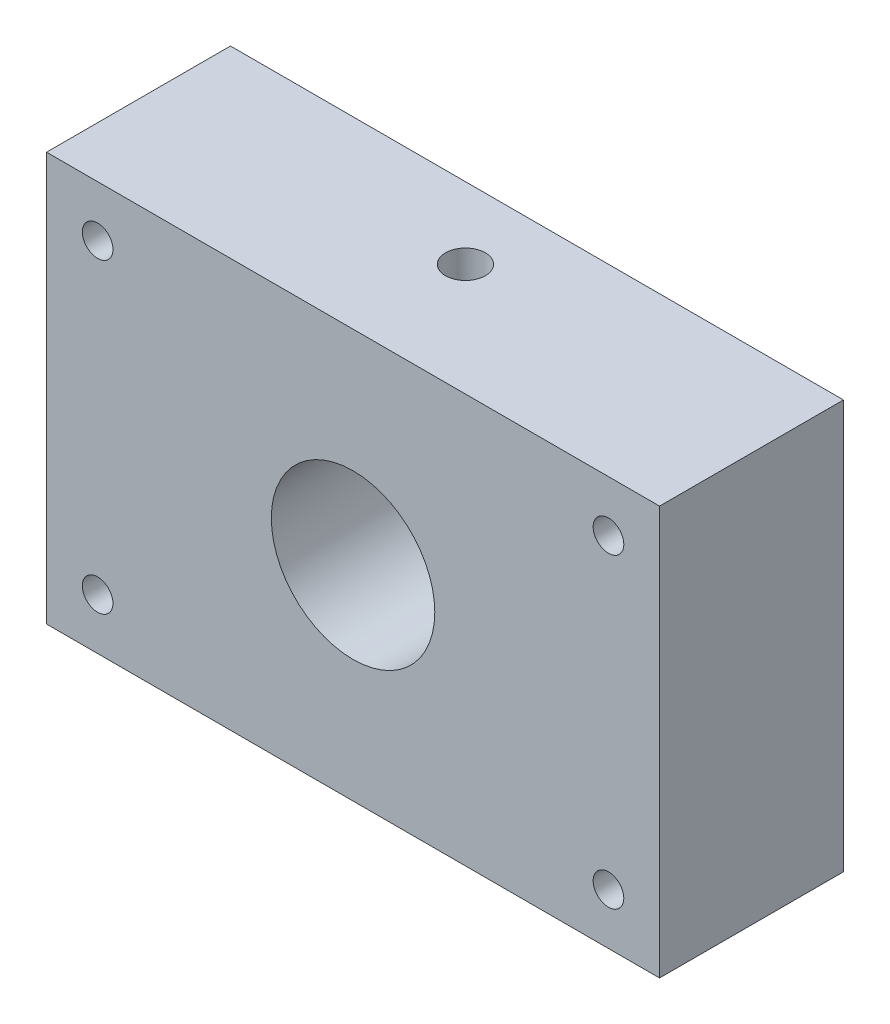
ISO-10303-21;
HEADER;
FILE_DESCRIPTION(('STEP AP214'),'2;1');
FILE_NAME('part.step','',(''),(''),'','','');
FILE_SCHEMA(('AUTOMOTIVE_DESIGN { 1 0 10303 214 1 1 1 1 }'));
ENDSEC;
DATA;
#1=APPLICATION_CONTEXT('core data for automotive mechanical design processes');
#2=APPLICATION_PROTOCOL_DEFINITION('international standard','automotive_design',2000,#1);
#3=PRODUCT_CONTEXT('',#1,'mechanical');
#4=PRODUCT('Part','Part','',(#3));
#5=PRODUCT_RELATED_PRODUCT_CATEGORY('part','',(#4));
#6=PRODUCT_DEFINITION_FORMATION('','',#4);
#7=PRODUCT_DEFINITION_CONTEXT('part definition',#1,'design');
#8=PRODUCT_DEFINITION('design','',#6,#7);
#9=PRODUCT_DEFINITION_SHAPE('','',#8);
#10=(LENGTH_UNIT() NAMED_UNIT(*) SI_UNIT(.MILLI.,.METRE.));
#11=(NAMED_UNIT(*) PLANE_ANGLE_UNIT() SI_UNIT($,.RADIAN.));
#12=(NAMED_UNIT(*) SI_UNIT($,.STERADIAN.) SOLID_ANGLE_UNIT());
#13=UNCERTAINTY_MEASURE_WITH_UNIT(LENGTH_MEASURE(1.E-05),#10,'distance_accuracy_value','');
#14=(GEOMETRIC_REPRESENTATION_CONTEXT(3) GLOBAL_UNCERTAINTY_ASSIGNED_CONTEXT((#13)) GLOBAL_UNIT_ASSIGNED_CONTEXT((#10,
#11,#12)) REPRESENTATION_CONTEXT('',''));
#15=CARTESIAN_POINT('',(0.,0.,0.));
#16=DIRECTION('',(0.,0.,1.));
#17=DIRECTION('',(1.,0.,0.));
#18=AXIS2_PLACEMENT_3D('',#15,#16,#17);
#19=CARTESIAN_POINT('',(0.,0.,18.));
#20=DIRECTION('',(0.,0.,1.));
#21=DIRECTION('',(1.,0.,0.));
#22=AXIS2_PLACEMENT_3D('',#19,#20,#21);
#23=PLANE('',#22);
#24=CARTESIAN_POINT('',(25.,-15.,18.));
#25=DIRECTION('',(0.,0.,1.));
#26=DIRECTION('',(1.,0.,0.));
#27=AXIS2_PLACEMENT_3D('',#24,#25,#26);
#28=CIRCLE('',#27,1.5);
#29=CARTESIAN_POINT('',(26.5,-15.,18.));
#30=VERTEX_POINT('',#29);
#31=EDGE_CURVE('E218',#30,#30,#28,.T.);
#32=ORIENTED_EDGE('',*,*,#31,.F.);
#33=EDGE_LOOP('',(#32));
#34=FACE_BOUND('',#33,.T.);
#35=CARTESIAN_POINT('',(-25.,15.,18.));
#36=DIRECTION('',(0.,0.,1.));
#37=DIRECTION('',(1.,0.,0.));
#38=AXIS2_PLACEMENT_3D('',#35,#36,#37);
#39=CIRCLE('',#38,1.5);
#40=CARTESIAN_POINT('',(-23.5,15.,18.));
#41=VERTEX_POINT('',#40);
#42=EDGE_CURVE('E119',#41,#41,#39,.T.);
#43=ORIENTED_EDGE('',*,*,#42,.F.);
#44=EDGE_LOOP('',(#43));
#45=FACE_BOUND('',#44,.T.);
#46=DIRECTION('',(0.,-1.,0.));
#47=VECTOR('',#46,1.);
#48=CARTESIAN_POINT('',(-30.,20.,18.));
#49=LINE('',#48,#47);
#50=CARTESIAN_POINT('',(-30.,20.,18.));
#51=VERTEX_POINT('',#50);
#52=CARTESIAN_POINT('',(-30.,-20.,18.));
#53=VERTEX_POINT('',#52);
#54=EDGE_CURVE('E128',#51,#53,#49,.T.);
#55=ORIENTED_EDGE('',*,*,#54,.T.);
#56=DIRECTION('',(1.,0.,0.));
#57=VECTOR('',#56,1.);
#58=CARTESIAN_POINT('',(-30.,-20.,18.));
#59=LINE('',#58,#57);
#60=CARTESIAN_POINT('',(30.,-20.,18.));
#61=VERTEX_POINT('',#60);
#62=EDGE_CURVE('E90',#53,#61,#59,.T.);
#63=ORIENTED_EDGE('',*,*,#62,.T.);
#64=DIRECTION('',(0.,1.,0.));
#65=VECTOR('',#64,1.);
#66=CARTESIAN_POINT('',(30.,20.,18.));
#67=LINE('',#66,#65);
#68=CARTESIAN_POINT('',(30.,20.,18.));
#69=VERTEX_POINT('',#68);
#70=EDGE_CURVE('E131',#61,#69,#67,.T.);
#71=ORIENTED_EDGE('',*,*,#70,.T.);
#72=DIRECTION('',(-1.,0.,0.));
#73=VECTOR('',#72,1.);
#74=CARTESIAN_POINT('',(-30.,20.,18.));
#75=LINE('',#74,#73);
#76=EDGE_CURVE('E61',#69,#51,#75,.T.);
#77=ORIENTED_EDGE('',*,*,#76,.T.);
#78=EDGE_LOOP('',(#55,#63,#71,#77));
#79=FACE_BOUND('',#78,.T.);
#80=CARTESIAN_POINT('',(0.,0.,18.));
#81=DIRECTION('',(0.,0.,1.));
#82=DIRECTION('',(1.,0.,0.));
#83=AXIS2_PLACEMENT_3D('',#80,#81,#82);
#84=CIRCLE('',#83,8.);
#85=CARTESIAN_POINT('',(8.,0.,18.));
#86=VERTEX_POINT('',#85);
#87=EDGE_CURVE('E114',#86,#86,#84,.T.);
#88=ORIENTED_EDGE('',*,*,#87,.F.);
#89=EDGE_LOOP('',(#88));
#90=FACE_BOUND('',#89,.T.);
#91=CARTESIAN_POINT('',(25.,15.,18.));
#92=DIRECTION('',(0.,0.,1.));
#93=DIRECTION('',(1.,0.,0.));
#94=AXIS2_PLACEMENT_3D('',#91,#92,#93);
#95=CIRCLE('',#94,1.5);
#96=CARTESIAN_POINT('',(26.5,15.,18.));
#97=VERTEX_POINT('',#96);
#98=EDGE_CURVE('E210',#97,#97,#95,.T.);
#99=ORIENTED_EDGE('',*,*,#98,.F.);
#100=EDGE_LOOP('',(#99));
#101=FACE_BOUND('',#100,.T.);
#102=CARTESIAN_POINT('',(-25.,-15.,18.));
#103=DIRECTION('',(0.,0.,1.));
#104=DIRECTION('',(1.,0.,0.));
#105=AXIS2_PLACEMENT_3D('',#102,#103,#104);
#106=CIRCLE('',#105,1.5);
#107=CARTESIAN_POINT('',(-23.5,-15.,18.));
#108=VERTEX_POINT('',#107);
#109=EDGE_CURVE('E213',#108,#108,#106,.T.);
#110=ORIENTED_EDGE('',*,*,#109,.F.);
#111=EDGE_LOOP('',(#110));
#112=FACE_BOUND('',#111,.T.);
#113=ADVANCED_FACE('F33',(#34,#45,#79,#90,#101,#112),#23,.T.);
#114=CARTESIAN_POINT('',(0.,0.,0.));
#115=DIRECTION('',(0.,0.,1.));
#116=DIRECTION('',(1.,0.,0.));
#117=AXIS2_PLACEMENT_3D('',#114,#115,#116);
#118=PLANE('',#117);
#119=DIRECTION('',(0.,-1.,0.));
#120=VECTOR('',#119,1.);
#121=CARTESIAN_POINT('',(-30.,20.,0.));
#122=LINE('',#121,#120);
#123=CARTESIAN_POINT('',(-30.,20.,0.));
#124=VERTEX_POINT('',#123);
#125=CARTESIAN_POINT('',(-30.,-20.,0.));
#126=VERTEX_POINT('',#125);
#127=EDGE_CURVE('E121',#124,#126,#122,.T.);
#128=ORIENTED_EDGE('',*,*,#127,.F.);
#129=DIRECTION('',(-1.,0.,0.));
#130=VECTOR('',#129,1.);
#131=CARTESIAN_POINT('',(-30.,20.,0.));
#132=LINE('',#131,#130);
#133=CARTESIAN_POINT('',(30.,20.,0.));
#134=VERTEX_POINT('',#133);
#135=EDGE_CURVE('E82',#134,#124,#132,.T.);
#136=ORIENTED_EDGE('',*,*,#135,.F.);
#137=DIRECTION('',(0.,1.,0.));
#138=VECTOR('',#137,1.);
#139=CARTESIAN_POINT('',(30.,20.,0.));
#140=LINE('',#139,#138);
#141=CARTESIAN_POINT('',(30.,-20.,0.));
#142=VERTEX_POINT('',#141);
#143=EDGE_CURVE('E139',#142,#134,#140,.T.);
#144=ORIENTED_EDGE('',*,*,#143,.F.);
#145=DIRECTION('',(1.,0.,0.));
#146=VECTOR('',#145,1.);
#147=CARTESIAN_POINT('',(-30.,-20.,0.));
#148=LINE('',#147,#146);
#149=EDGE_CURVE('E137',#126,#142,#148,.T.);
#150=ORIENTED_EDGE('',*,*,#149,.F.);
#151=EDGE_LOOP('',(#128,#136,#144,#150));
#152=FACE_BOUND('',#151,.T.);
#153=CARTESIAN_POINT('',(0.,0.,0.));
#154=DIRECTION('',(0.,0.,1.));
#155=DIRECTION('',(1.,0.,0.));
#156=AXIS2_PLACEMENT_3D('',#153,#154,#155);
#157=CIRCLE('',#156,8.);
#158=CARTESIAN_POINT('',(8.,0.,0.));
#159=VERTEX_POINT('',#158);
#160=EDGE_CURVE('E117',#159,#159,#157,.T.);
#161=ORIENTED_EDGE('',*,*,#160,.T.);
#162=EDGE_LOOP('',(#161));
#163=FACE_BOUND('',#162,.T.);
#164=CARTESIAN_POINT('',(-25.,15.,0.));
#165=DIRECTION('',(0.,0.,1.));
#166=DIRECTION('',(1.,0.,0.));
#167=AXIS2_PLACEMENT_3D('',#164,#165,#166);
#168=CIRCLE('',#167,1.5);
#169=CARTESIAN_POINT('',(-23.5,15.,0.));
#170=VERTEX_POINT('',#169);
#171=EDGE_CURVE('E124',#170,#170,#168,.T.);
#172=ORIENTED_EDGE('',*,*,#171,.T.);
#173=EDGE_LOOP('',(#172));
#174=FACE_BOUND('',#173,.T.);
#175=CARTESIAN_POINT('',(25.,15.,0.));
#176=DIRECTION('',(0.,0.,1.));
#177=DIRECTION('',(1.,0.,0.));
#178=AXIS2_PLACEMENT_3D('',#175,#176,#177);
#179=CIRCLE('',#178,1.5);
#180=CARTESIAN_POINT('',(26.5,15.,0.));
#181=VERTEX_POINT('',#180);
#182=EDGE_CURVE('E225',#181,#181,#179,.T.);
#183=ORIENTED_EDGE('',*,*,#182,.T.);
#184=EDGE_LOOP('',(#183));
#185=FACE_BOUND('',#184,.T.);
#186=CARTESIAN_POINT('',(25.,-15.,0.));
#187=DIRECTION('',(0.,0.,1.));
#188=DIRECTION('',(1.,0.,0.));
#189=AXIS2_PLACEMENT_3D('',#186,#187,#188);
#190=CIRCLE('',#189,1.5);
#191=CARTESIAN_POINT('',(26.5,-15.,0.));
#192=VERTEX_POINT('',#191);
#193=EDGE_CURVE('E214',#192,#192,#190,.T.);
#194=ORIENTED_EDGE('',*,*,#193,.T.);
#195=EDGE_LOOP('',(#194));
#196=FACE_BOUND('',#195,.T.);
#197=CARTESIAN_POINT('',(-25.,-15.,0.));
#198=DIRECTION('',(0.,0.,1.));
#199=DIRECTION('',(1.,0.,0.));
#200=AXIS2_PLACEMENT_3D('',#197,#198,#199);
#201=CIRCLE('',#200,1.5);
#202=CARTESIAN_POINT('',(-23.5,-15.,0.));
#203=VERTEX_POINT('',#202);
#204=EDGE_CURVE('E215',#203,#203,#201,.T.);
#205=ORIENTED_EDGE('',*,*,#204,.T.);
#206=EDGE_LOOP('',(#205));
#207=FACE_BOUND('',#206,.T.);
#208=ADVANCED_FACE('F177',(#152,#163,#174,#185,#196,#207),#118,.F.);
#209=CARTESIAN_POINT('',(-30.,20.,18.));
#210=DIRECTION('',(1.,0.,0.));
#211=DIRECTION('',(0.,1.,0.));
#212=AXIS2_PLACEMENT_3D('',#209,#210,#211);
#213=PLANE('',#212);
#214=ORIENTED_EDGE('',*,*,#127,.T.);
#215=DIRECTION('',(0.,0.,-1.));
#216=VECTOR('',#215,1.);
#217=CARTESIAN_POINT('',(-30.,-20.,18.));
#218=LINE('',#217,#216);
#219=EDGE_CURVE('E99',#53,#126,#218,.T.);
#220=ORIENTED_EDGE('',*,*,#219,.F.);
#221=ORIENTED_EDGE('',*,*,#54,.F.);
#222=DIRECTION('',(0.,0.,-1.));
#223=VECTOR('',#222,1.);
#224=CARTESIAN_POINT('',(-30.,20.,18.));
#225=LINE('',#224,#223);
#226=EDGE_CURVE('E134',#51,#124,#225,.T.);
#227=ORIENTED_EDGE('',*,*,#226,.T.);
#228=EDGE_LOOP('',(#214,#220,#221,#227));
#229=FACE_BOUND('',#228,.T.);
#230=ADVANCED_FACE('F35',(#229),#213,.F.);
#231=CARTESIAN_POINT('',(-30.,-20.,18.));
#232=DIRECTION('',(0.,1.,0.));
#233=DIRECTION('',(0.,0.,1.));
#234=AXIS2_PLACEMENT_3D('',#231,#232,#233);
#235=PLANE('',#234);
#236=ORIENTED_EDGE('',*,*,#149,.T.);
#237=DIRECTION('',(0.,0.,-1.));
#238=VECTOR('',#237,1.);
#239=CARTESIAN_POINT('',(30.,-20.,18.));
#240=LINE('',#239,#238);
#241=EDGE_CURVE('E145',#61,#142,#240,.T.);
#242=ORIENTED_EDGE('',*,*,#241,.F.);
#243=ORIENTED_EDGE('',*,*,#62,.F.);
#244=ORIENTED_EDGE('',*,*,#219,.T.);
#245=EDGE_LOOP('',(#236,#242,#243,#244));
#246=FACE_BOUND('',#245,.T.);
#247=ADVANCED_FACE('F192',(#246),#235,.F.);
#248=CARTESIAN_POINT('',(30.,20.,18.));
#249=DIRECTION('',(-1.,0.,0.));
#250=DIRECTION('',(0.,-1.,0.));
#251=AXIS2_PLACEMENT_3D('',#248,#249,#250);
#252=PLANE('',#251);
#253=ORIENTED_EDGE('',*,*,#143,.T.);
#254=DIRECTION('',(0.,0.,-1.));
#255=VECTOR('',#254,1.);
#256=CARTESIAN_POINT('',(30.,20.,18.));
#257=LINE('',#256,#255);
#258=EDGE_CURVE('E143',#69,#134,#257,.T.);
#259=ORIENTED_EDGE('',*,*,#258,.F.);
#260=ORIENTED_EDGE('',*,*,#70,.F.);
#261=ORIENTED_EDGE('',*,*,#241,.T.);
#262=EDGE_LOOP('',(#253,#259,#260,#261));
#263=FACE_BOUND('',#262,.T.);
#264=ADVANCED_FACE('F189',(#263),#252,.F.);
#265=CARTESIAN_POINT('',(-30.,20.,18.));
#266=DIRECTION('',(0.,-1.,0.));
#267=DIRECTION('',(0.,0.,-1.));
#268=AXIS2_PLACEMENT_3D('',#265,#266,#267);
#269=PLANE('',#268);
#270=CARTESIAN_POINT('',(0.,20.,7.));
#271=DIRECTION('',(0.,1.,0.));
#272=DIRECTION('',(0.,0.,1.));
#273=AXIS2_PLACEMENT_3D('',#270,#271,#272);
#274=CIRCLE('',#273,1.95);
#275=CARTESIAN_POINT('',(0.,20.,8.95));
#276=VERTEX_POINT('',#275);
#277=EDGE_CURVE('E101',#276,#276,#274,.T.);
#278=ORIENTED_EDGE('',*,*,#277,.F.);
#279=EDGE_LOOP('',(#278));
#280=FACE_BOUND('',#279,.T.);
#281=ORIENTED_EDGE('',*,*,#135,.T.);
#282=ORIENTED_EDGE('',*,*,#226,.F.);
#283=ORIENTED_EDGE('',*,*,#76,.F.);
#284=ORIENTED_EDGE('',*,*,#258,.T.);
#285=EDGE_LOOP('',(#281,#282,#283,#284));
#286=FACE_BOUND('',#285,.T.);
#287=ADVANCED_FACE('F109',(#280,#286),#269,.F.);
#288=CARTESIAN_POINT('',(0.,0.,18.));
#289=DIRECTION('',(0.,0.,-1.));
#290=DIRECTION('',(-1.,0.,0.));
#291=AXIS2_PLACEMENT_3D('',#288,#289,#290);
#292=CYLINDRICAL_SURFACE('',#291,8.);
#293=CARTESIAN_POINT('',(0.,8.,8.95));
#294=CARTESIAN_POINT('',(-0.107825541490164,7.99999812398273,8.94999682183177));
#295=CARTESIAN_POINT('',(-0.215687152153546,7.99779824841766,8.94102654176208));
#296=CARTESIAN_POINT('',(-0.42832480514805,7.98923551729992,8.90543268890908));
#297=CARTESIAN_POINT('',(-0.533098964159805,7.98287017361838,8.87879856498192));
#298=CARTESIAN_POINT('',(-0.736459839202564,7.96668218515695,8.80877793748346));
#299=CARTESIAN_POINT('',(-0.835053629702963,7.95686358162135,8.76541101006659));
#300=CARTESIAN_POINT('',(-1.02356595357982,7.93481767763216,8.66322330184763));
#301=CARTESIAN_POINT('',(-1.1134842999433,7.92259032527145,8.60440218800774));
#302=CARTESIAN_POINT('',(-1.28386086698915,7.89678825782025,8.47175445463593));
#303=CARTESIAN_POINT('',(-1.36412430075997,7.88319358507604,8.39768151253214));
#304=CARTESIAN_POINT('',(-1.51122051014568,7.85632331426188,8.23716045972535));
#305=CARTESIAN_POINT('',(-1.57805184087065,7.84304775065356,8.15071101939458));
#306=CARTESIAN_POINT('',(-1.69729088412022,7.81811858876697,7.96639367512499));
#307=CARTESIAN_POINT('',(-1.74948291477334,7.80649037982793,7.8683824968033));
#308=CARTESIAN_POINT('',(-1.8365755587542,7.78646266441492,7.66464869201617));
#309=CARTESIAN_POINT('',(-1.87147878716349,7.77806266968861,7.5589272345745));
#310=CARTESIAN_POINT('',(-1.92234287708522,7.76564722121663,7.34490997198221));
#311=CARTESIAN_POINT('',(-1.93865287997234,7.76155106978318,7.23670193336565));
#312=CARTESIAN_POINT('',(-1.95295467836058,7.75796537465037,7.0190139501536));
#313=CARTESIAN_POINT('',(-1.95094929819327,7.75847512069647,6.90953420426265));
#314=CARTESIAN_POINT('',(-1.92895632159768,7.76397097561509,6.6950691996586));
#315=CARTESIAN_POINT('',(-1.90938252355569,7.76885407095745,6.59003845719776));
#316=CARTESIAN_POINT('',(-1.85346748882609,7.78238252959748,6.3847982462271));
#317=CARTESIAN_POINT('',(-1.81712511033683,7.79102814908965,6.28458910654175));
#318=CARTESIAN_POINT('',(-1.72834625372847,7.81120351135204,6.09071587901025));
#319=CARTESIAN_POINT('',(-1.67575774022246,7.82276030051405,5.99712434413158));
#320=CARTESIAN_POINT('',(-1.55608584838053,7.84744030507865,5.81994482321774));
#321=CARTESIAN_POINT('',(-1.48900004948234,7.86056378190176,5.73635851134644));
#322=CARTESIAN_POINT('',(-1.3400845848836,7.8873339673074,5.57918840351171));
#323=CARTESIAN_POINT('',(-1.25790514144594,7.90098522610574,5.50593639209504));
#324=CARTESIAN_POINT('',(-1.08226639751907,7.92695201062349,5.37419226949631));
#325=CARTESIAN_POINT('',(-0.98880678523419,7.93926749940296,5.31570056644279));
#326=CARTESIAN_POINT('',(-0.792801708545605,7.96123158682625,5.21502410934408));
#327=CARTESIAN_POINT('',(-0.690228678925881,7.97087170385544,5.17289105169199));
#328=CARTESIAN_POINT('',(-0.47916907750809,7.98633697733114,5.10655671924996));
#329=CARTESIAN_POINT('',(-0.370683583325712,7.9921628264703,5.08235218843299));
#330=CARTESIAN_POINT('',(-0.153717168488066,7.99924145808818,5.05306360458976));
#331=CARTESIAN_POINT('',(-0.0453007166825693,8.00060234885088,5.04752744768386));
#332=CARTESIAN_POINT('',(0.170909058374863,7.99890459808067,5.05449582780563));
#333=CARTESIAN_POINT('',(0.278702433987298,7.99584633349827,5.06699882610733));
#334=CARTESIAN_POINT('',(0.489050481826631,7.98572296905669,5.10931739396946));
#335=CARTESIAN_POINT('',(0.591657346380782,7.97871452374987,5.13888831200327));
#336=CARTESIAN_POINT('',(0.790450216782408,7.96147928584442,5.2142255251914));
#337=CARTESIAN_POINT('',(0.886635592183451,7.95125217780675,5.25999340775371));
#338=CARTESIAN_POINT('',(1.07166885553698,7.92845331331329,5.36731523649015));
#339=CARTESIAN_POINT('',(1.16036369334166,7.915844556532,5.42912500965479));
#340=CARTESIAN_POINT('',(1.32628320089302,7.88974265905516,5.56644705401925));
#341=CARTESIAN_POINT('',(1.40350599043646,7.8762493739116,5.64196156685192));
#342=CARTESIAN_POINT('',(1.54613688310293,7.84951325345627,5.80664409584002));
#343=CARTESIAN_POINT('',(1.6112286114313,7.83628353162478,5.89608869586244));
#344=CARTESIAN_POINT('',(1.72547550781794,7.81192421325621,6.0849002539484));
#345=CARTESIAN_POINT('',(1.774631388641,7.80079452280006,6.18426676797306));
#346=CARTESIAN_POINT('',(1.85524968511174,7.78201534298735,6.38956218265129));
#347=CARTESIAN_POINT('',(1.88681679118352,7.77434531454056,6.49544799607551));
#348=CARTESIAN_POINT('',(1.93164528513614,7.76332978239116,6.71123783287753));
#349=CARTESIAN_POINT('',(1.94491044241092,7.75998338821968,6.821141024065));
#350=CARTESIAN_POINT('',(1.95256894634341,7.75805948381842,7.03863304640844));
#351=CARTESIAN_POINT('',(1.94746702418088,7.75935442438941,7.14620326812579));
#352=CARTESIAN_POINT('',(1.91968573190631,7.76627373037302,7.35890024712218));
#353=CARTESIAN_POINT('',(1.89700668189059,7.7718980169441,7.46402704886232));
#354=CARTESIAN_POINT('',(1.83498419377968,7.78677301395669,7.66833526083284));
#355=CARTESIAN_POINT('',(1.79573099287175,7.79600406750628,7.76754559346473));
#356=CARTESIAN_POINT('',(1.70174666967726,7.81705617091581,7.95804126350876));
#357=CARTESIAN_POINT('',(1.64701350726209,7.82887756211417,8.04932555426136));
#358=CARTESIAN_POINT('',(1.52202143543851,7.85414572503987,8.22382742463378));
#359=CARTESIAN_POINT('',(1.45141027125362,7.86762560685991,8.30678794117326));
#360=CARTESIAN_POINT('',(1.29735891965429,7.89448935051981,8.45984682618867));
#361=CARTESIAN_POINT('',(1.21391571184344,7.90787318897475,8.52994215792479));
#362=CARTESIAN_POINT('',(1.03485885825304,7.93330779350192,8.65643765815572));
#363=CARTESIAN_POINT('',(0.939062604399942,7.94533206279427,8.71258505148698));
#364=CARTESIAN_POINT('',(0.739108798054155,7.96641645212532,8.80788945732363));
#365=CARTESIAN_POINT('',(0.634957524695249,7.97547877267175,8.84705909013161));
#366=CARTESIAN_POINT('',(0.442438530778237,7.98821925812234,8.90123291571962));
#367=CARTESIAN_POINT('',(0.355016498300938,7.99260733431618,8.91948205581971));
#368=CARTESIAN_POINT('',(0.17840446118701,7.99849838355984,8.94386650212096));
#369=CARTESIAN_POINT('',(0.0892145768284125,8.00000155221188,8.95000262960825));
#370=CARTESIAN_POINT('',(0.,8.,8.95));
#371=B_SPLINE_CURVE_WITH_KNOTS('',3,(#293,#294,#295,#296,#297,#298,#299,#300,#301,#302,#303,
#304,#305,#306,#307,#308,#309,#310,#311,#312,#313,#314,#315,#316,#317,#318,#319,#320,#321,#322,
#323,#324,#325,#326,#327,#328,#329,#330,#331,#332,#333,#334,#335,#336,#337,#338,#339,#340,#341,
#342,#343,#344,#345,#346,#347,#348,#349,#350,#351,#352,#353,#354,#355,#356,#357,#358,#359,#360,
#361,#362,#363,#364,#365,#366,#367,#368,#369,#370),.UNSPECIFIED.,.T.,.F.,(4,2,2,2,2,2,2,2,2,2,2,
2,2,2,2,2,2,2,2,2,2,2,2,2,2,2,2,2,2,2,2,2,2,2,2,2,2,2,4),(0.,0.323149767425679,
0.646492735965794,0.9694585583561,1.29243134123258,1.62109958545945,1.94980316559493,
2.28312175151942,2.61638990470425,2.94329121266095,3.27014211151139,3.58949087290252,
3.90886138251301,4.23131613346554,4.55382476524249,4.88505850288188,5.21630139826589,
5.54858272499559,5.8808036908021,6.20491893485493,6.52900653376303,6.84856011841651,
7.16814503007939,7.49317840267634,7.81826498775663,8.15090856117375,8.48353725434384,
8.81416435538543,9.14472335166204,9.46626870395887,9.78780820074495,10.1076192156546,
10.4274723986202,10.7552799014246,11.0831646817381,11.4166173816455,11.7498217848863,
12.017213204978,12.2845864947816),.UNSPECIFIED.);
#372=CARTESIAN_POINT('',(0.,8.,8.95));
#373=VERTEX_POINT('',#372);
#374=EDGE_CURVE('E37',#373,#373,#371,.T.);
#375=ORIENTED_EDGE('',*,*,#374,.F.);
#376=EDGE_LOOP('',(#375));
#377=FACE_BOUND('',#376,.T.);
#378=CARTESIAN_POINT('',(0.,-8.,8.95));
#379=CARTESIAN_POINT('',(0.107825541490164,-7.99999812398273,8.94999682183177));
#380=CARTESIAN_POINT('',(0.215687152153546,-7.99779824841766,8.94102654176209));
#381=CARTESIAN_POINT('',(0.42832480514805,-7.98923551729992,8.90543268890908));
#382=CARTESIAN_POINT('',(0.533098964159805,-7.98287017361838,8.87879856498192));
#383=CARTESIAN_POINT('',(0.736459839202563,-7.96668218515695,8.80877793748346));
#384=CARTESIAN_POINT('',(0.835053629702963,-7.95686358162135,8.76541101006659));
#385=CARTESIAN_POINT('',(1.02356595357982,-7.93481767763216,8.66322330184763));
#386=CARTESIAN_POINT('',(1.1134842999433,-7.92259032527145,8.60440218800774));
#387=CARTESIAN_POINT('',(1.28386086698915,-7.89678825782025,8.47175445463594));
#388=CARTESIAN_POINT('',(1.36412430075997,-7.88319358507604,8.39768151253215));
#389=CARTESIAN_POINT('',(1.51122051014568,-7.85632331426188,8.23716045972535));
#390=CARTESIAN_POINT('',(1.57805184087065,-7.84304775065356,8.15071101939458));
#391=CARTESIAN_POINT('',(1.69729088412022,-7.81811858876697,7.96639367512499));
#392=CARTESIAN_POINT('',(1.74948291477334,-7.80649037982793,7.8683824968033));
#393=CARTESIAN_POINT('',(1.8365755587542,-7.78646266441492,7.66464869201617));
#394=CARTESIAN_POINT('',(1.87147878716349,-7.77806266968861,7.5589272345745));
#395=CARTESIAN_POINT('',(1.92234287708522,-7.76564722121663,7.34490997198222));
#396=CARTESIAN_POINT('',(1.93865287997234,-7.76155106978318,7.23670193336565));
#397=CARTESIAN_POINT('',(1.95295467836058,-7.75796537465037,7.0190139501536));
#398=CARTESIAN_POINT('',(1.95094929819327,-7.75847512069647,6.90953420426265));
#399=CARTESIAN_POINT('',(1.92895632159768,-7.76397097561509,6.69506919965861));
#400=CARTESIAN_POINT('',(1.90938252355569,-7.76885407095745,6.59003845719776));
#401=CARTESIAN_POINT('',(1.85346748882609,-7.78238252959747,6.3847982462271));
#402=CARTESIAN_POINT('',(1.81712511033683,-7.79102814908965,6.28458910654176));
#403=CARTESIAN_POINT('',(1.72834625372847,-7.81120351135204,6.09071587901026));
#404=CARTESIAN_POINT('',(1.67575774022247,-7.82276030051405,5.99712434413158));
#405=CARTESIAN_POINT('',(1.55608584838053,-7.84744030507865,5.81994482321774));
#406=CARTESIAN_POINT('',(1.48900004948235,-7.86056378190176,5.73635851134644));
#407=CARTESIAN_POINT('',(1.3400845848836,-7.8873339673074,5.57918840351171));
#408=CARTESIAN_POINT('',(1.25790514144594,-7.90098522610574,5.50593639209504));
#409=CARTESIAN_POINT('',(1.08226639751907,-7.92695201062349,5.37419226949631));
#410=CARTESIAN_POINT('',(0.988806785234189,-7.93926749940296,5.31570056644279));
#411=CARTESIAN_POINT('',(0.792801708545604,-7.96123158682625,5.21502410934408));
#412=CARTESIAN_POINT('',(0.69022867892588,-7.97087170385544,5.17289105169199));
#413=CARTESIAN_POINT('',(0.479169077508089,-7.98633697733114,5.10655671924996));
#414=CARTESIAN_POINT('',(0.370683583325711,-7.9921628264703,5.08235218843299));
#415=CARTESIAN_POINT('',(0.153717168488066,-7.99924145808818,5.05306360458976));
#416=CARTESIAN_POINT('',(0.0453007166825695,-8.00060234885088,5.04752744768386));
#417=CARTESIAN_POINT('',(-0.170909058374862,-7.99890459808067,5.05449582780563));
#418=CARTESIAN_POINT('',(-0.278702433987297,-7.99584633349827,5.06699882610733));
#419=CARTESIAN_POINT('',(-0.489050481826631,-7.98572296905669,5.10931739396946));
#420=CARTESIAN_POINT('',(-0.591657346380782,-7.97871452374987,5.13888831200327));
#421=CARTESIAN_POINT('',(-0.790450216782407,-7.96147928584442,5.2142255251914));
#422=CARTESIAN_POINT('',(-0.88663559218345,-7.95125217780675,5.25999340775371));
#423=CARTESIAN_POINT('',(-1.07166885553698,-7.92845331331329,5.36731523649015));
#424=CARTESIAN_POINT('',(-1.16036369334166,-7.915844556532,5.42912500965479));
#425=CARTESIAN_POINT('',(-1.32628320089302,-7.88974265905516,5.56644705401925));
#426=CARTESIAN_POINT('',(-1.40350599043646,-7.8762493739116,5.64196156685192));
#427=CARTESIAN_POINT('',(-1.54613688310293,-7.84951325345627,5.80664409584002));
#428=CARTESIAN_POINT('',(-1.6112286114313,-7.83628353162478,5.89608869586244));
#429=CARTESIAN_POINT('',(-1.72547550781794,-7.81192421325621,6.0849002539484));
#430=CARTESIAN_POINT('',(-1.774631388641,-7.80079452280006,6.18426676797306));
#431=CARTESIAN_POINT('',(-1.85524968511174,-7.78201534298735,6.38956218265129));
#432=CARTESIAN_POINT('',(-1.88681679118352,-7.77434531454056,6.4954479960755));
#433=CARTESIAN_POINT('',(-1.93164528513614,-7.76332978239116,6.71123783287753));
#434=CARTESIAN_POINT('',(-1.94491044241092,-7.75998338821968,6.821141024065));
#435=CARTESIAN_POINT('',(-1.95256894634341,-7.75805948381842,7.03863304640844));
#436=CARTESIAN_POINT('',(-1.94746702418088,-7.75935442438941,7.14620326812579));
#437=CARTESIAN_POINT('',(-1.91968573190631,-7.76627373037302,7.35890024712218));
#438=CARTESIAN_POINT('',(-1.89700668189059,-7.7718980169441,7.46402704886232));
#439=CARTESIAN_POINT('',(-1.83498419377968,-7.78677301395669,7.66833526083284));
#440=CARTESIAN_POINT('',(-1.79573099287175,-7.79600406750628,7.76754559346473));
#441=CARTESIAN_POINT('',(-1.70174666967726,-7.81705617091581,7.95804126350876));
#442=CARTESIAN_POINT('',(-1.64701350726209,-7.82887756211417,8.04932555426136));
#443=CARTESIAN_POINT('',(-1.52202143543851,-7.85414572503987,8.22382742463378));
#444=CARTESIAN_POINT('',(-1.45141027125362,-7.86762560685991,8.30678794117326));
#445=CARTESIAN_POINT('',(-1.29735891965429,-7.89448935051981,8.45984682618867));
#446=CARTESIAN_POINT('',(-1.21391571184344,-7.90787318897475,8.52994215792479));
#447=CARTESIAN_POINT('',(-1.03485885825304,-7.93330779350192,8.65643765815572));
#448=CARTESIAN_POINT('',(-0.939062604399942,-7.94533206279427,8.71258505148698));
#449=CARTESIAN_POINT('',(-0.739108798054155,-7.96641645212532,8.80788945732363));
#450=CARTESIAN_POINT('',(-0.634957524695249,-7.97547877267175,8.84705909013161));
#451=CARTESIAN_POINT('',(-0.442438530778237,-7.98821925812234,8.90123291571962));
#452=CARTESIAN_POINT('',(-0.355016498300937,-7.99260733431618,8.91948205581971));
#453=CARTESIAN_POINT('',(-0.178404461187009,-7.99849838355984,8.94386650212096));
#454=CARTESIAN_POINT('',(-0.0892145768284119,-8.00000155221188,8.95000262960825));
#455=CARTESIAN_POINT('',(0.,-8.,8.95));
#456=B_SPLINE_CURVE_WITH_KNOTS('',3,(#378,#379,#380,#381,#382,#383,#384,#385,#386,#387,#388,
#389,#390,#391,#392,#393,#394,#395,#396,#397,#398,#399,#400,#401,#402,#403,#404,#405,#406,#407,
#408,#409,#410,#411,#412,#413,#414,#415,#416,#417,#418,#419,#420,#421,#422,#423,#424,#425,#426,
#427,#428,#429,#430,#431,#432,#433,#434,#435,#436,#437,#438,#439,#440,#441,#442,#443,#444,#445,
#446,#447,#448,#449,#450,#451,#452,#453,#454,#455),.UNSPECIFIED.,.T.,.F.,(4,2,2,2,2,2,2,2,2,2,2,
2,2,2,2,2,2,2,2,2,2,2,2,2,2,2,2,2,2,2,2,2,2,2,2,2,2,2,4),(0.,0.323149767425679,
0.646492735965794,0.9694585583561,1.29243134123258,1.62109958545944,1.94980316559493,
2.28312175151942,2.61638990470425,2.94329121266094,3.27014211151139,3.58949087290252,
3.90886138251301,4.23131613346554,4.55382476524249,4.88505850288189,5.21630139826589,
5.5485827249956,5.8808036908021,6.20491893485493,6.52900653376303,6.84856011841651,
7.16814503007939,7.49317840267634,7.81826498775663,8.15090856117375,8.48353725434384,
8.81416435538543,9.14472335166204,9.46626870395887,9.78780820074495,10.1076192156546,
10.4274723986202,10.7552799014246,11.0831646817381,11.4166173816455,11.7498217848863,
12.017213204978,12.2845864947816),.UNSPECIFIED.);
#457=CARTESIAN_POINT('',(0.,-8.,8.95));
#458=VERTEX_POINT('',#457);
#459=CARTESIAN_POINT('',(0.,-8.,5.05));
#460=VERTEX_POINT('',#459);
#461=EDGE_CURVE('E11',#458,#460,#456,.T.);
#462=ORIENTED_EDGE('',*,*,#461,.F.);
#463=EDGE_CURVE('E46',#460,#458,#456,.T.);
#464=ORIENTED_EDGE('',*,*,#463,.F.);
#465=EDGE_LOOP('',(#462,#464));
#466=FACE_BOUND('',#465,.T.);
#467=ORIENTED_EDGE('',*,*,#87,.T.);
#468=EDGE_LOOP('',(#467));
#469=FACE_BOUND('',#468,.T.);
#470=ORIENTED_EDGE('',*,*,#160,.F.);
#471=EDGE_LOOP('',(#470));
#472=FACE_BOUND('',#471,.T.);
#473=ADVANCED_FACE('F105',(#377,#466,#469,#472),#292,.F.);
#474=CARTESIAN_POINT('',(-25.,15.,18.));
#475=DIRECTION('',(0.,0.,-1.));
#476=DIRECTION('',(-1.,0.,0.));
#477=AXIS2_PLACEMENT_3D('',#474,#475,#476);
#478=CYLINDRICAL_SURFACE('',#477,1.5);
#479=ORIENTED_EDGE('',*,*,#42,.T.);
#480=EDGE_LOOP('',(#479));
#481=FACE_BOUND('',#480,.T.);
#482=ORIENTED_EDGE('',*,*,#171,.F.);
#483=EDGE_LOOP('',(#482));
#484=FACE_BOUND('',#483,.T.);
#485=ADVANCED_FACE('F108',(#481,#484),#478,.F.);
#486=CARTESIAN_POINT('',(25.,15.,18.));
#487=DIRECTION('',(0.,0.,-1.));
#488=DIRECTION('',(-1.,0.,0.));
#489=AXIS2_PLACEMENT_3D('',#486,#487,#488);
#490=CYLINDRICAL_SURFACE('',#489,1.5);
#491=ORIENTED_EDGE('',*,*,#98,.T.);
#492=EDGE_LOOP('',(#491));
#493=FACE_BOUND('',#492,.T.);
#494=ORIENTED_EDGE('',*,*,#182,.F.);
#495=EDGE_LOOP('',(#494));
#496=FACE_BOUND('',#495,.T.);
#497=ADVANCED_FACE('F167',(#493,#496),#490,.F.);
#498=CARTESIAN_POINT('',(25.,-15.,18.));
#499=DIRECTION('',(0.,0.,-1.));
#500=DIRECTION('',(-1.,0.,0.));
#501=AXIS2_PLACEMENT_3D('',#498,#499,#500);
#502=CYLINDRICAL_SURFACE('',#501,1.5);
#503=ORIENTED_EDGE('',*,*,#31,.T.);
#504=EDGE_LOOP('',(#503));
#505=FACE_BOUND('',#504,.T.);
#506=ORIENTED_EDGE('',*,*,#193,.F.);
#507=EDGE_LOOP('',(#506));
#508=FACE_BOUND('',#507,.T.);
#509=ADVANCED_FACE('F163',(#505,#508),#502,.F.);
#510=CARTESIAN_POINT('',(-25.,-15.,18.));
#511=DIRECTION('',(0.,0.,-1.));
#512=DIRECTION('',(-1.,0.,0.));
#513=AXIS2_PLACEMENT_3D('',#510,#511,#512);
#514=CYLINDRICAL_SURFACE('',#513,1.5);
#515=ORIENTED_EDGE('',*,*,#109,.T.);
#516=EDGE_LOOP('',(#515));
#517=FACE_BOUND('',#516,.T.);
#518=ORIENTED_EDGE('',*,*,#204,.F.);
#519=EDGE_LOOP('',(#518));
#520=FACE_BOUND('',#519,.T.);
#521=ADVANCED_FACE('F158',(#517,#520),#514,.F.);
#522=CARTESIAN_POINT('',(0.,-8.,7.));
#523=DIRECTION('',(0.,1.,0.));
#524=DIRECTION('',(0.,0.,1.));
#525=AXIS2_PLACEMENT_3D('',#522,#523,#524);
#526=CYLINDRICAL_SURFACE('',#525,1.95);
#527=ORIENTED_EDGE('',*,*,#374,.T.);
#528=EDGE_LOOP('',(#527));
#529=FACE_BOUND('',#528,.T.);
#530=ORIENTED_EDGE('',*,*,#277,.T.);
#531=EDGE_LOOP('',(#530));
#532=FACE_BOUND('',#531,.T.);
#533=ADVANCED_FACE('F153',(#529,#532),#526,.F.);
#534=ORIENTED_EDGE('',*,*,#461,.T.);
#535=CARTESIAN_POINT('',(0.,-8.,7.));
#536=DIRECTION('',(0.,1.,0.));
#537=DIRECTION('',(0.,0.,1.));
#538=AXIS2_PLACEMENT_3D('',#535,#536,#537);
#539=CIRCLE('',#538,1.95);
#540=EDGE_CURVE('E52',#458,#460,#539,.T.);
#541=ORIENTED_EDGE('',*,*,#540,.F.);
#542=EDGE_LOOP('',(#534,#541));
#543=FACE_BOUND('',#542,.T.);
#544=ADVANCED_FACE('F104',(#543),#526,.F.);
#545=ORIENTED_EDGE('',*,*,#463,.T.);
#546=EDGE_CURVE('E96',#460,#458,#539,.T.);
#547=ORIENTED_EDGE('',*,*,#546,.F.);
#548=EDGE_LOOP('',(#545,#547));
#549=FACE_BOUND('',#548,.T.);
#550=ADVANCED_FACE('F95',(#549),#526,.F.);
#551=CARTESIAN_POINT('',(0.,-8.,7.));
#552=DIRECTION('',(0.,1.,0.));
#553=DIRECTION('',(0.,0.,1.));
#554=AXIS2_PLACEMENT_3D('',#551,#552,#553);
#555=PLANE('',#554);
#556=ORIENTED_EDGE('',*,*,#546,.T.);
#557=ORIENTED_EDGE('',*,*,#540,.T.);
#558=EDGE_LOOP('',(#556,#557));
#559=FACE_BOUND('',#558,.T.);
#560=ADVANCED_FACE('F100',(#559),#555,.T.);
#561=CLOSED_SHELL('',(#113,#208,#230,#247,#264,#287,#473,#485,#497,#509,#521,#533,#544,#550,#560));
#562=MANIFOLD_SOLID_BREP('B2',#561);
#563=ADVANCED_BREP_SHAPE_REPRESENTATION('',(#18,#562),#14);
#564=SHAPE_DEFINITION_REPRESENTATION(#9,#563);
ENDSEC;
END-ISO-10303-21;
